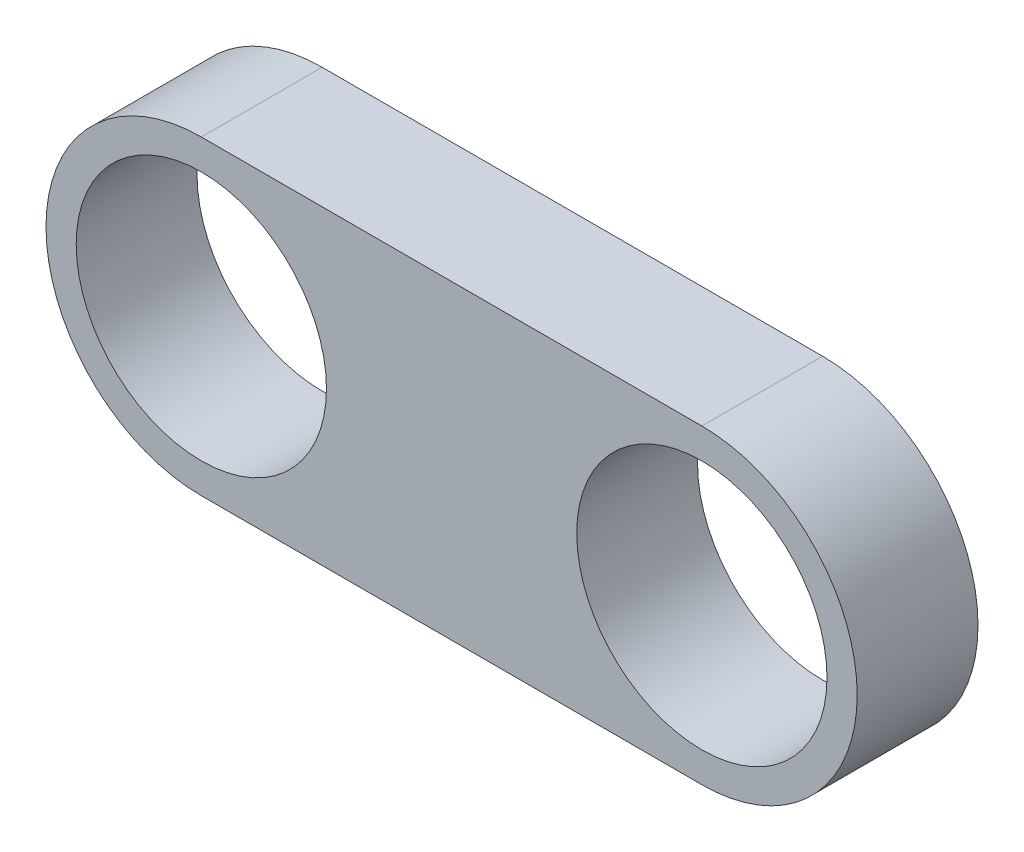
ISO-10303-21;
HEADER;
FILE_DESCRIPTION(('STEP AP214'),'2;1');
FILE_NAME('part.step','',(''),(''),'','','');
FILE_SCHEMA(('AUTOMOTIVE_DESIGN { 1 0 10303 214 1 1 1 1 }'));
ENDSEC;
DATA;
#1=APPLICATION_CONTEXT('core data for automotive mechanical design processes');
#2=APPLICATION_PROTOCOL_DEFINITION('international standard','automotive_design',2000,#1);
#3=PRODUCT_CONTEXT('',#1,'mechanical');
#4=PRODUCT('Part','Part','',(#3));
#5=PRODUCT_RELATED_PRODUCT_CATEGORY('part','',(#4));
#6=PRODUCT_DEFINITION_FORMATION('','',#4);
#7=PRODUCT_DEFINITION_CONTEXT('part definition',#1,'design');
#8=PRODUCT_DEFINITION('design','',#6,#7);
#9=PRODUCT_DEFINITION_SHAPE('','',#8);
#10=(LENGTH_UNIT() NAMED_UNIT(*) SI_UNIT(.MILLI.,.METRE.));
#11=(NAMED_UNIT(*) PLANE_ANGLE_UNIT() SI_UNIT($,.RADIAN.));
#12=(NAMED_UNIT(*) SI_UNIT($,.STERADIAN.) SOLID_ANGLE_UNIT());
#13=UNCERTAINTY_MEASURE_WITH_UNIT(LENGTH_MEASURE(1.E-05),#10,'distance_accuracy_value','');
#14=(GEOMETRIC_REPRESENTATION_CONTEXT(3) GLOBAL_UNCERTAINTY_ASSIGNED_CONTEXT((#13)) GLOBAL_UNIT_ASSIGNED_CONTEXT((#10,
#11,#12)) REPRESENTATION_CONTEXT('',''));
#15=CARTESIAN_POINT('',(0.,0.,0.));
#16=DIRECTION('',(0.,0.,1.));
#17=DIRECTION('',(1.,0.,0.));
#18=AXIS2_PLACEMENT_3D('',#15,#16,#17);
#19=CARTESIAN_POINT('',(-14.5,0.,7.));
#20=DIRECTION('',(0.,0.,1.));
#21=DIRECTION('',(1.,0.,0.));
#22=AXIS2_PLACEMENT_3D('',#19,#20,#21);
#23=PLANE('',#22);
#24=CARTESIAN_POINT('',(-14.5,0.,7.));
#25=DIRECTION('',(0.,0.,1.));
#26=DIRECTION('',(1.,0.,0.));
#27=AXIS2_PLACEMENT_3D('',#24,#25,#26);
#28=CIRCLE('',#27,9.);
#29=CARTESIAN_POINT('',(-14.5,9.,7.));
#30=VERTEX_POINT('',#29);
#31=CARTESIAN_POINT('',(-14.5,-9.,7.));
#32=VERTEX_POINT('',#31);
#33=EDGE_CURVE('E90',#30,#32,#28,.T.);
#34=ORIENTED_EDGE('',*,*,#33,.T.);
#35=DIRECTION('',(1.,0.,0.));
#36=VECTOR('',#35,1.);
#37=CARTESIAN_POINT('',(14.5,-9.,7.));
#38=LINE('',#37,#36);
#39=CARTESIAN_POINT('',(14.5,-9.,7.));
#40=VERTEX_POINT('',#39);
#41=EDGE_CURVE('E85',#32,#40,#38,.T.);
#42=ORIENTED_EDGE('',*,*,#41,.T.);
#43=CARTESIAN_POINT('',(14.5,0.,7.));
#44=DIRECTION('',(0.,0.,1.));
#45=DIRECTION('',(-1.,0.,0.));
#46=AXIS2_PLACEMENT_3D('',#43,#44,#45);
#47=CIRCLE('',#46,8.99999999999999);
#48=CARTESIAN_POINT('',(14.5,8.99999999999998,7.));
#49=VERTEX_POINT('',#48);
#50=EDGE_CURVE('E88',#40,#49,#47,.T.);
#51=ORIENTED_EDGE('',*,*,#50,.T.);
#52=DIRECTION('',(-1.,0.,0.));
#53=VECTOR('',#52,1.);
#54=CARTESIAN_POINT('',(14.5,8.99999999999998,7.));
#55=LINE('',#54,#53);
#56=EDGE_CURVE('E55',#49,#30,#55,.T.);
#57=ORIENTED_EDGE('',*,*,#56,.T.);
#58=EDGE_LOOP('',(#34,#42,#51,#57));
#59=FACE_BOUND('',#58,.T.);
#60=CARTESIAN_POINT('',(-14.5,0.,7.));
#61=DIRECTION('',(0.,0.,-1.));
#62=DIRECTION('',(-1.,0.,0.));
#63=AXIS2_PLACEMENT_3D('',#60,#61,#62);
#64=CIRCLE('',#63,7.25);
#65=CARTESIAN_POINT('',(-21.75,0.,7.));
#66=VERTEX_POINT('',#65);
#67=EDGE_CURVE('E105',#66,#66,#64,.T.);
#68=ORIENTED_EDGE('',*,*,#67,.T.);
#69=EDGE_LOOP('',(#68));
#70=FACE_BOUND('',#69,.T.);
#71=CARTESIAN_POINT('',(14.5,0.,7.));
#72=DIRECTION('',(0.,0.,-1.));
#73=DIRECTION('',(-1.,0.,0.));
#74=AXIS2_PLACEMENT_3D('',#71,#72,#73);
#75=CIRCLE('',#74,7.25);
#76=CARTESIAN_POINT('',(7.25,0.,7.));
#77=VERTEX_POINT('',#76);
#78=EDGE_CURVE('E121',#77,#77,#75,.T.);
#79=ORIENTED_EDGE('',*,*,#78,.T.);
#80=EDGE_LOOP('',(#79));
#81=FACE_BOUND('',#80,.T.);
#82=ADVANCED_FACE('F38',(#59,#70,#81),#23,.T.);
#83=CARTESIAN_POINT('',(-14.5,0.,7.));
#84=DIRECTION('',(0.,0.,-1.));
#85=DIRECTION('',(-1.,0.,0.));
#86=AXIS2_PLACEMENT_3D('',#83,#84,#85);
#87=CYLINDRICAL_SURFACE('',#86,9.);
#88=CARTESIAN_POINT('',(-14.5,0.,0.));
#89=DIRECTION('',(0.,0.,1.));
#90=DIRECTION('',(1.,0.,0.));
#91=AXIS2_PLACEMENT_3D('',#88,#89,#90);
#92=CIRCLE('',#91,9.);
#93=CARTESIAN_POINT('',(-14.5,9.,0.));
#94=VERTEX_POINT('',#93);
#95=CARTESIAN_POINT('',(-14.5,-9.,0.));
#96=VERTEX_POINT('',#95);
#97=EDGE_CURVE('E102',#94,#96,#92,.T.);
#98=ORIENTED_EDGE('',*,*,#97,.T.);
#99=DIRECTION('',(0.,0.,-1.));
#100=VECTOR('',#99,1.);
#101=CARTESIAN_POINT('',(-14.5,-9.,7.));
#102=LINE('',#101,#100);
#103=EDGE_CURVE('E11',#32,#96,#102,.T.);
#104=ORIENTED_EDGE('',*,*,#103,.F.);
#105=ORIENTED_EDGE('',*,*,#33,.F.);
#106=DIRECTION('',(0.,0.,-1.));
#107=VECTOR('',#106,1.);
#108=CARTESIAN_POINT('',(-14.5,9.,7.));
#109=LINE('',#108,#107);
#110=EDGE_CURVE('E98',#30,#94,#109,.T.);
#111=ORIENTED_EDGE('',*,*,#110,.T.);
#112=EDGE_LOOP('',(#98,#104,#105,#111));
#113=FACE_BOUND('',#112,.T.);
#114=ADVANCED_FACE('F40',(#113),#87,.T.);
#115=CARTESIAN_POINT('',(14.5,-9.,7.));
#116=DIRECTION('',(0.,1.,0.));
#117=DIRECTION('',(-1.,0.,0.));
#118=AXIS2_PLACEMENT_3D('',#115,#116,#117);
#119=PLANE('',#118);
#120=DIRECTION('',(1.,0.,0.));
#121=VECTOR('',#120,1.);
#122=CARTESIAN_POINT('',(14.5,-9.,0.));
#123=LINE('',#122,#121);
#124=CARTESIAN_POINT('',(14.5,-9.,0.));
#125=VERTEX_POINT('',#124);
#126=EDGE_CURVE('E94',#96,#125,#123,.T.);
#127=ORIENTED_EDGE('',*,*,#126,.T.);
#128=DIRECTION('',(0.,0.,-1.));
#129=VECTOR('',#128,1.);
#130=CARTESIAN_POINT('',(14.5,-9.,7.));
#131=LINE('',#130,#129);
#132=EDGE_CURVE('E47',#40,#125,#131,.T.);
#133=ORIENTED_EDGE('',*,*,#132,.F.);
#134=ORIENTED_EDGE('',*,*,#41,.F.);
#135=ORIENTED_EDGE('',*,*,#103,.T.);
#136=EDGE_LOOP('',(#127,#133,#134,#135));
#137=FACE_BOUND('',#136,.T.);
#138=ADVANCED_FACE('F93',(#137),#119,.F.);
#139=CARTESIAN_POINT('',(14.5,0.,7.));
#140=DIRECTION('',(0.,0.,-1.));
#141=DIRECTION('',(-1.,0.,0.));
#142=AXIS2_PLACEMENT_3D('',#139,#140,#141);
#143=CYLINDRICAL_SURFACE('',#142,8.99999999999999);
#144=CARTESIAN_POINT('',(14.5,0.,0.));
#145=DIRECTION('',(0.,0.,1.));
#146=DIRECTION('',(-1.,0.,0.));
#147=AXIS2_PLACEMENT_3D('',#144,#145,#146);
#148=CIRCLE('',#147,8.99999999999999);
#149=CARTESIAN_POINT('',(14.5,8.99999999999998,0.));
#150=VERTEX_POINT('',#149);
#151=EDGE_CURVE('E72',#125,#150,#148,.T.);
#152=ORIENTED_EDGE('',*,*,#151,.T.);
#153=DIRECTION('',(0.,0.,-1.));
#154=VECTOR('',#153,1.);
#155=CARTESIAN_POINT('',(14.5,8.99999999999998,7.));
#156=LINE('',#155,#154);
#157=EDGE_CURVE('E95',#49,#150,#156,.T.);
#158=ORIENTED_EDGE('',*,*,#157,.F.);
#159=ORIENTED_EDGE('',*,*,#50,.F.);
#160=ORIENTED_EDGE('',*,*,#132,.T.);
#161=EDGE_LOOP('',(#152,#158,#159,#160));
#162=FACE_BOUND('',#161,.T.);
#163=ADVANCED_FACE('F96',(#162),#143,.T.);
#164=CARTESIAN_POINT('',(14.5,8.99999999999998,7.));
#165=DIRECTION('',(0.,-1.,0.));
#166=DIRECTION('',(1.,0.,0.));
#167=AXIS2_PLACEMENT_3D('',#164,#165,#166);
#168=PLANE('',#167);
#169=DIRECTION('',(-1.,0.,0.));
#170=VECTOR('',#169,1.);
#171=CARTESIAN_POINT('',(14.5,8.99999999999998,0.));
#172=LINE('',#171,#170);
#173=EDGE_CURVE('E78',#150,#94,#172,.T.);
#174=ORIENTED_EDGE('',*,*,#173,.T.);
#175=ORIENTED_EDGE('',*,*,#110,.F.);
#176=ORIENTED_EDGE('',*,*,#56,.F.);
#177=ORIENTED_EDGE('',*,*,#157,.T.);
#178=EDGE_LOOP('',(#174,#175,#176,#177));
#179=FACE_BOUND('',#178,.T.);
#180=ADVANCED_FACE('F110',(#179),#168,.F.);
#181=CARTESIAN_POINT('',(-14.5,0.,0.));
#182=DIRECTION('',(0.,0.,1.));
#183=DIRECTION('',(1.,0.,0.));
#184=AXIS2_PLACEMENT_3D('',#181,#182,#183);
#185=PLANE('',#184);
#186=CARTESIAN_POINT('',(14.5,0.,0.));
#187=DIRECTION('',(0.,0.,-1.));
#188=DIRECTION('',(-1.,0.,0.));
#189=AXIS2_PLACEMENT_3D('',#186,#187,#188);
#190=CIRCLE('',#189,7.25);
#191=CARTESIAN_POINT('',(7.25,0.,0.));
#192=VERTEX_POINT('',#191);
#193=EDGE_CURVE('E124',#192,#192,#190,.T.);
#194=ORIENTED_EDGE('',*,*,#193,.F.);
#195=EDGE_LOOP('',(#194));
#196=FACE_BOUND('',#195,.T.);
#197=CARTESIAN_POINT('',(-14.5,0.,0.));
#198=DIRECTION('',(0.,0.,-1.));
#199=DIRECTION('',(-1.,0.,0.));
#200=AXIS2_PLACEMENT_3D('',#197,#198,#199);
#201=CIRCLE('',#200,7.25);
#202=CARTESIAN_POINT('',(-21.75,0.,0.));
#203=VERTEX_POINT('',#202);
#204=EDGE_CURVE('E118',#203,#203,#201,.T.);
#205=ORIENTED_EDGE('',*,*,#204,.F.);
#206=EDGE_LOOP('',(#205));
#207=FACE_BOUND('',#206,.T.);
#208=ORIENTED_EDGE('',*,*,#97,.F.);
#209=ORIENTED_EDGE('',*,*,#173,.F.);
#210=ORIENTED_EDGE('',*,*,#151,.F.);
#211=ORIENTED_EDGE('',*,*,#126,.F.);
#212=EDGE_LOOP('',(#208,#209,#210,#211));
#213=FACE_BOUND('',#212,.T.);
#214=ADVANCED_FACE('F113',(#196,#207,#213),#185,.F.);
#215=CARTESIAN_POINT('',(-14.5,0.,0.));
#216=DIRECTION('',(0.,0.,-1.));
#217=DIRECTION('',(-1.,0.,0.));
#218=AXIS2_PLACEMENT_3D('',#215,#216,#217);
#219=CYLINDRICAL_SURFACE('',#218,7.25);
#220=ORIENTED_EDGE('',*,*,#67,.F.);
#221=EDGE_LOOP('',(#220));
#222=FACE_BOUND('',#221,.T.);
#223=ORIENTED_EDGE('',*,*,#204,.T.);
#224=EDGE_LOOP('',(#223));
#225=FACE_BOUND('',#224,.T.);
#226=ADVANCED_FACE('F132',(#222,#225),#219,.F.);
#227=CARTESIAN_POINT('',(14.5,0.,0.));
#228=DIRECTION('',(0.,0.,-1.));
#229=DIRECTION('',(-1.,0.,0.));
#230=AXIS2_PLACEMENT_3D('',#227,#228,#229);
#231=CYLINDRICAL_SURFACE('',#230,7.25);
#232=ORIENTED_EDGE('',*,*,#78,.F.);
#233=EDGE_LOOP('',(#232));
#234=FACE_BOUND('',#233,.T.);
#235=ORIENTED_EDGE('',*,*,#193,.T.);
#236=EDGE_LOOP('',(#235));
#237=FACE_BOUND('',#236,.T.);
#238=ADVANCED_FACE('F128',(#234,#237),#231,.F.);
#239=CLOSED_SHELL('',(#82,#114,#138,#163,#180,#214,#226,#238));
#240=MANIFOLD_SOLID_BREP('B2',#239);
#241=ADVANCED_BREP_SHAPE_REPRESENTATION('',(#18,#240),#14);
#242=SHAPE_DEFINITION_REPRESENTATION(#9,#241);
ENDSEC;
END-ISO-10303-21;
